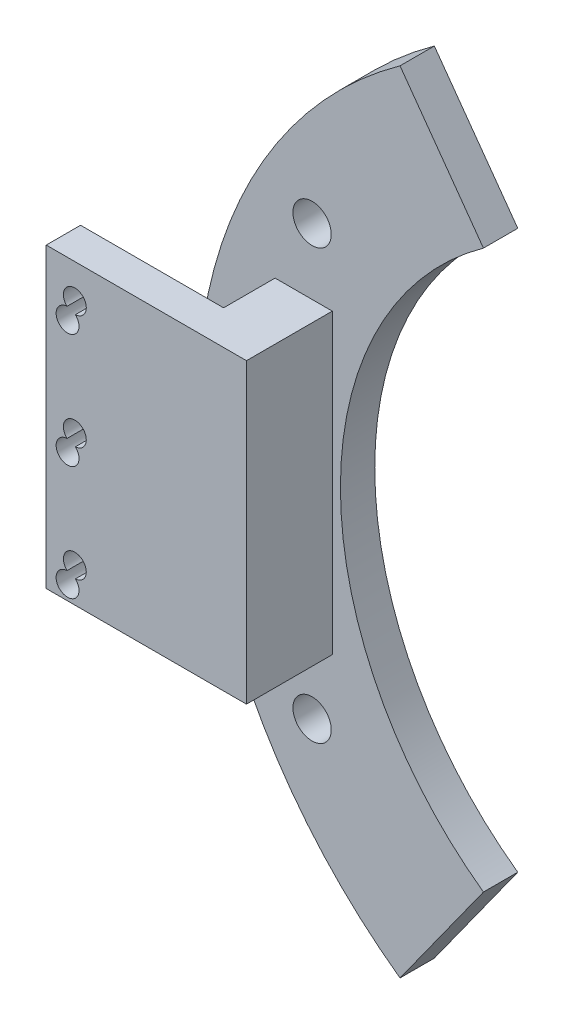
ISO-10303-21;
HEADER;
FILE_DESCRIPTION(('STEP AP214'),'2;1');
FILE_NAME('part.step','',(''),(''),'','','');
FILE_SCHEMA(('AUTOMOTIVE_DESIGN { 1 0 10303 214 1 1 1 1 }'));
ENDSEC;
DATA;
#1=APPLICATION_CONTEXT('core data for automotive mechanical design processes');
#2=APPLICATION_PROTOCOL_DEFINITION('international standard','automotive_design',2000,#1);
#3=PRODUCT_CONTEXT('',#1,'mechanical');
#4=PRODUCT('Part','Part','',(#3));
#5=PRODUCT_RELATED_PRODUCT_CATEGORY('part','',(#4));
#6=PRODUCT_DEFINITION_FORMATION('','',#4);
#7=PRODUCT_DEFINITION_CONTEXT('part definition',#1,'design');
#8=PRODUCT_DEFINITION('design','',#6,#7);
#9=PRODUCT_DEFINITION_SHAPE('','',#8);
#10=(LENGTH_UNIT() NAMED_UNIT(*) SI_UNIT(.MILLI.,.METRE.));
#11=(NAMED_UNIT(*) PLANE_ANGLE_UNIT() SI_UNIT($,.RADIAN.));
#12=(NAMED_UNIT(*) SI_UNIT($,.STERADIAN.) SOLID_ANGLE_UNIT());
#13=UNCERTAINTY_MEASURE_WITH_UNIT(LENGTH_MEASURE(1.E-05),#10,'distance_accuracy_value','');
#14=(GEOMETRIC_REPRESENTATION_CONTEXT(3) GLOBAL_UNCERTAINTY_ASSIGNED_CONTEXT((#13)) GLOBAL_UNIT_ASSIGNED_CONTEXT((#10,
#11,#12)) REPRESENTATION_CONTEXT('',''));
#15=CARTESIAN_POINT('',(0.,0.,0.));
#16=DIRECTION('',(0.,0.,1.));
#17=DIRECTION('',(1.,0.,0.));
#18=AXIS2_PLACEMENT_3D('',#15,#16,#17);
#19=CARTESIAN_POINT('',(-71.4195328291549,25.9902704667621,21.));
#20=DIRECTION('',(1.,0.,0.));
#21=DIRECTION('',(0.,0.,-1.));
#22=AXIS2_PLACEMENT_3D('',#19,#20,#21);
#23=PLANE('',#22);
#24=DIRECTION('',(0.,-1.,0.));
#25=VECTOR('',#24,1.);
#26=CARTESIAN_POINT('',(-71.4195328291549,25.9902704667621,15.));
#27=LINE('',#26,#25);
#28=CARTESIAN_POINT('',(-71.4195328291549,25.9902704667621,15.));
#29=VERTEX_POINT('',#28);
#30=CARTESIAN_POINT('',(-71.4195328291549,-26.0097295332379,15.));
#31=VERTEX_POINT('',#30);
#32=EDGE_CURVE('E189',#29,#31,#27,.T.);
#33=ORIENTED_EDGE('',*,*,#32,.F.);
#34=DIRECTION('',(0.,0.,-1.));
#35=VECTOR('',#34,1.);
#36=CARTESIAN_POINT('',(-71.4195328291549,25.9902704667621,21.));
#37=LINE('',#36,#35);
#38=CARTESIAN_POINT('',(-71.4195328291549,25.9902704667621,6.));
#39=VERTEX_POINT('',#38);
#40=EDGE_CURVE('E211',#29,#39,#37,.T.);
#41=ORIENTED_EDGE('',*,*,#40,.T.);
#42=DIRECTION('',(0.,-1.,0.));
#43=VECTOR('',#42,1.);
#44=CARTESIAN_POINT('',(-71.4195328291549,25.9902704667621,6.));
#45=LINE('',#44,#43);
#46=CARTESIAN_POINT('',(-71.4195328291549,-26.0097295332379,6.));
#47=VERTEX_POINT('',#46);
#48=EDGE_CURVE('E203',#39,#47,#45,.T.);
#49=ORIENTED_EDGE('',*,*,#48,.T.);
#50=DIRECTION('',(0.,0.,-1.));
#51=VECTOR('',#50,1.);
#52=CARTESIAN_POINT('',(-71.4195328291549,-26.0097295332379,21.));
#53=LINE('',#52,#51);
#54=EDGE_CURVE('E227',#31,#47,#53,.T.);
#55=ORIENTED_EDGE('',*,*,#54,.F.);
#56=EDGE_LOOP('',(#33,#41,#49,#55));
#57=FACE_BOUND('',#56,.T.);
#58=ADVANCED_FACE('F41',(#57),#23,.F.);
#59=CARTESIAN_POINT('',(0.,0.,6.));
#60=DIRECTION('',(0.,0.,1.));
#61=DIRECTION('',(1.,0.,0.));
#62=AXIS2_PLACEMENT_3D('',#59,#60,#61);
#63=PLANE('',#62);
#64=DIRECTION('',(-0.583333333333333,-0.812232862067414,0.));
#65=VECTOR('',#64,1.);
#66=CARTESIAN_POINT('',(0.,0.,6.));
#67=LINE('',#66,#65);
#68=CARTESIAN_POINT('',(-35.,-48.7339717240448,6.));
#69=VERTEX_POINT('',#68);
#70=CARTESIAN_POINT('',(-49.5833333333334,-69.0397932757301,6.));
#71=VERTEX_POINT('',#70);
#72=EDGE_CURVE('E181',#69,#71,#67,.T.);
#73=ORIENTED_EDGE('',*,*,#72,.F.);
#74=CARTESIAN_POINT('',(0.,0.,6.));
#75=DIRECTION('',(0.,0.,1.));
#76=DIRECTION('',(1.,0.,0.));
#77=AXIS2_PLACEMENT_3D('',#74,#75,#76);
#78=CIRCLE('',#77,60.);
#79=CARTESIAN_POINT('',(-35.,48.7339717240448,6.));
#80=VERTEX_POINT('',#79);
#81=EDGE_CURVE('E236',#80,#69,#78,.T.);
#82=ORIENTED_EDGE('',*,*,#81,.F.);
#83=DIRECTION('',(0.583333333333334,-0.812232862067413,0.));
#84=VECTOR('',#83,1.);
#85=CARTESIAN_POINT('',(0.,0.,6.));
#86=LINE('',#85,#84);
#87=CARTESIAN_POINT('',(-49.5833333333334,69.0397932757302,6.));
#88=VERTEX_POINT('',#87);
#89=EDGE_CURVE('E290',#88,#80,#86,.T.);
#90=ORIENTED_EDGE('',*,*,#89,.F.);
#91=CARTESIAN_POINT('',(0.,0.,6.));
#92=DIRECTION('',(0.,0.,1.));
#93=DIRECTION('',(1.,0.,0.));
#94=AXIS2_PLACEMENT_3D('',#91,#92,#93);
#95=CIRCLE('',#94,85.);
#96=EDGE_CURVE('E244',#88,#71,#95,.T.);
#97=ORIENTED_EDGE('',*,*,#96,.T.);
#98=EDGE_LOOP('',(#73,#82,#90,#97));
#99=FACE_BOUND('',#98,.T.);
#100=CARTESIAN_POINT('',(-64.951905283833,37.4999999999998,6.));
#101=DIRECTION('',(0.,0.,1.));
#102=DIRECTION('',(-1.,0.,0.));
#103=AXIS2_PLACEMENT_3D('',#100,#101,#102);
#104=CIRCLE('',#103,3.35);
#105=CARTESIAN_POINT('',(-68.301905283833,37.4999999999998,6.));
#106=VERTEX_POINT('',#105);
#107=EDGE_CURVE('E229',#106,#106,#104,.T.);
#108=ORIENTED_EDGE('',*,*,#107,.F.);
#109=EDGE_LOOP('',(#108));
#110=FACE_BOUND('',#109,.T.);
#111=CARTESIAN_POINT('',(-64.9519052838327,-37.5000000000003,6.));
#112=DIRECTION('',(0.,0.,1.));
#113=DIRECTION('',(-1.,0.,0.));
#114=AXIS2_PLACEMENT_3D('',#111,#112,#113);
#115=CIRCLE('',#114,3.35);
#116=CARTESIAN_POINT('',(-68.3019052838327,-37.5000000000003,6.));
#117=VERTEX_POINT('',#116);
#118=EDGE_CURVE('E232',#117,#117,#115,.T.);
#119=ORIENTED_EDGE('',*,*,#118,.F.);
#120=EDGE_LOOP('',(#119));
#121=FACE_BOUND('',#120,.T.);
#122=DIRECTION('',(1.,0.,0.));
#123=VECTOR('',#122,1.);
#124=CARTESIAN_POINT('',(-71.4195328291549,-26.0097295332379,6.));
#125=LINE('',#124,#123);
#126=CARTESIAN_POINT('',(-61.4195328291549,-26.0097295332379,6.));
#127=VERTEX_POINT('',#126);
#128=EDGE_CURVE('E214',#47,#127,#125,.T.);
#129=ORIENTED_EDGE('',*,*,#128,.F.);
#130=ORIENTED_EDGE('',*,*,#48,.F.);
#131=DIRECTION('',(-1.,0.,0.));
#132=VECTOR('',#131,1.);
#133=CARTESIAN_POINT('',(-71.4195328291549,25.9902704667621,6.));
#134=LINE('',#133,#132);
#135=CARTESIAN_POINT('',(-61.4195328291549,25.9902704667621,6.));
#136=VERTEX_POINT('',#135);
#137=EDGE_CURVE('E207',#136,#39,#134,.T.);
#138=ORIENTED_EDGE('',*,*,#137,.F.);
#139=DIRECTION('',(0.,1.,0.));
#140=VECTOR('',#139,1.);
#141=CARTESIAN_POINT('',(-61.4195328291549,25.9902704667621,6.));
#142=LINE('',#141,#140);
#143=EDGE_CURVE('E216',#127,#136,#142,.T.);
#144=ORIENTED_EDGE('',*,*,#143,.F.);
#145=EDGE_LOOP('',(#129,#130,#138,#144));
#146=FACE_BOUND('',#145,.T.);
#147=ADVANCED_FACE('F305',(#99,#110,#121,#146),#63,.T.);
#148=CARTESIAN_POINT('',(0.,0.,0.));
#149=DIRECTION('',(0.,0.,1.));
#150=DIRECTION('',(1.,0.,0.));
#151=AXIS2_PLACEMENT_3D('',#148,#149,#150);
#152=PLANE('',#151);
#153=CARTESIAN_POINT('',(-64.951905283833,37.4999999999998,0.));
#154=DIRECTION('',(0.,0.,1.));
#155=DIRECTION('',(1.,0.,0.));
#156=AXIS2_PLACEMENT_3D('',#153,#154,#155);
#157=CIRCLE('',#156,3.35);
#158=CARTESIAN_POINT('',(-61.601905283833,37.4999999999998,0.));
#159=VERTEX_POINT('',#158);
#160=EDGE_CURVE('E243',#159,#159,#157,.T.);
#161=ORIENTED_EDGE('',*,*,#160,.T.);
#162=EDGE_LOOP('',(#161));
#163=FACE_BOUND('',#162,.T.);
#164=CARTESIAN_POINT('',(-64.9519052838327,-37.5000000000003,0.));
#165=DIRECTION('',(0.,0.,1.));
#166=DIRECTION('',(1.,0.,0.));
#167=AXIS2_PLACEMENT_3D('',#164,#165,#166);
#168=CIRCLE('',#167,3.35);
#169=CARTESIAN_POINT('',(-61.6019052838327,-37.5000000000003,0.));
#170=VERTEX_POINT('',#169);
#171=EDGE_CURVE('E235',#170,#170,#168,.T.);
#172=ORIENTED_EDGE('',*,*,#171,.T.);
#173=EDGE_LOOP('',(#172));
#174=FACE_BOUND('',#173,.T.);
#175=CARTESIAN_POINT('',(0.,0.,0.));
#176=DIRECTION('',(0.,0.,1.));
#177=DIRECTION('',(1.,0.,0.));
#178=AXIS2_PLACEMENT_3D('',#175,#176,#177);
#179=CIRCLE('',#178,60.);
#180=CARTESIAN_POINT('',(-35.,48.7339717240448,0.));
#181=VERTEX_POINT('',#180);
#182=CARTESIAN_POINT('',(-35.,-48.7339717240448,0.));
#183=VERTEX_POINT('',#182);
#184=EDGE_CURVE('E240',#181,#183,#179,.T.);
#185=ORIENTED_EDGE('',*,*,#184,.T.);
#186=DIRECTION('',(-0.583333333333333,-0.812232862067414,0.));
#187=VECTOR('',#186,1.);
#188=CARTESIAN_POINT('',(0.,0.,0.));
#189=LINE('',#188,#187);
#190=CARTESIAN_POINT('',(-49.5833333333334,-69.0397932757301,0.));
#191=VERTEX_POINT('',#190);
#192=EDGE_CURVE('E292',#183,#191,#189,.T.);
#193=ORIENTED_EDGE('',*,*,#192,.T.);
#194=CARTESIAN_POINT('',(0.,0.,0.));
#195=DIRECTION('',(0.,0.,1.));
#196=DIRECTION('',(1.,0.,0.));
#197=AXIS2_PLACEMENT_3D('',#194,#195,#196);
#198=CIRCLE('',#197,85.);
#199=CARTESIAN_POINT('',(-49.5833333333334,69.0397932757302,0.));
#200=VERTEX_POINT('',#199);
#201=EDGE_CURVE('E239',#200,#191,#198,.T.);
#202=ORIENTED_EDGE('',*,*,#201,.F.);
#203=DIRECTION('',(0.583333333333334,-0.812232862067413,0.));
#204=VECTOR('',#203,1.);
#205=CARTESIAN_POINT('',(0.,0.,0.));
#206=LINE('',#205,#204);
#207=EDGE_CURVE('E286',#200,#181,#206,.T.);
#208=ORIENTED_EDGE('',*,*,#207,.T.);
#209=EDGE_LOOP('',(#185,#193,#202,#208));
#210=FACE_BOUND('',#209,.T.);
#211=ADVANCED_FACE('F314',(#163,#174,#210),#152,.F.);
#212=CARTESIAN_POINT('',(0.,0.,6.));
#213=DIRECTION('',(0.,0.,-1.));
#214=DIRECTION('',(-1.,0.,0.));
#215=AXIS2_PLACEMENT_3D('',#212,#213,#214);
#216=CYLINDRICAL_SURFACE('',#215,85.);
#217=ORIENTED_EDGE('',*,*,#201,.T.);
#218=DIRECTION('',(0.,0.,1.));
#219=VECTOR('',#218,1.);
#220=CARTESIAN_POINT('',(-49.5833333333334,-69.0397932757301,-44.));
#221=LINE('',#220,#219);
#222=EDGE_CURVE('E283',#191,#71,#221,.T.);
#223=ORIENTED_EDGE('',*,*,#222,.T.);
#224=ORIENTED_EDGE('',*,*,#96,.F.);
#225=DIRECTION('',(0.,0.,1.));
#226=VECTOR('',#225,1.);
#227=CARTESIAN_POINT('',(-49.5833333333334,69.0397932757302,-44.));
#228=LINE('',#227,#226);
#229=EDGE_CURVE('E278',#200,#88,#228,.T.);
#230=ORIENTED_EDGE('',*,*,#229,.F.);
#231=EDGE_LOOP('',(#217,#223,#224,#230));
#232=FACE_BOUND('',#231,.T.);
#233=ADVANCED_FACE('F43',(#232),#216,.T.);
#234=CARTESIAN_POINT('',(0.,0.,6.));
#235=DIRECTION('',(0.,0.,-1.));
#236=DIRECTION('',(-1.,0.,0.));
#237=AXIS2_PLACEMENT_3D('',#234,#235,#236);
#238=CYLINDRICAL_SURFACE('',#237,60.);
#239=DIRECTION('',(0.,0.,-1.));
#240=VECTOR('',#239,1.);
#241=CARTESIAN_POINT('',(-35.,-48.7339717240448,6.));
#242=LINE('',#241,#240);
#243=EDGE_CURVE('E165',#183,#69,#242,.F.);
#244=ORIENTED_EDGE('',*,*,#243,.F.);
#245=ORIENTED_EDGE('',*,*,#184,.F.);
#246=DIRECTION('',(0.,0.,-1.));
#247=VECTOR('',#246,1.);
#248=CARTESIAN_POINT('',(-35.,48.7339717240448,6.));
#249=LINE('',#248,#247);
#250=EDGE_CURVE('E247',#80,#181,#249,.T.);
#251=ORIENTED_EDGE('',*,*,#250,.F.);
#252=ORIENTED_EDGE('',*,*,#81,.T.);
#253=EDGE_LOOP('',(#244,#245,#251,#252));
#254=FACE_BOUND('',#253,.T.);
#255=ADVANCED_FACE('F312',(#254),#238,.F.);
#256=CARTESIAN_POINT('',(-64.9519052838327,-37.5000000000003,-4.));
#257=DIRECTION('',(0.,0.,1.));
#258=DIRECTION('',(1.,0.,0.));
#259=AXIS2_PLACEMENT_3D('',#256,#257,#258);
#260=CYLINDRICAL_SURFACE('',#259,3.35);
#261=ORIENTED_EDGE('',*,*,#118,.T.);
#262=EDGE_LOOP('',(#261));
#263=FACE_BOUND('',#262,.T.);
#264=ORIENTED_EDGE('',*,*,#171,.F.);
#265=EDGE_LOOP('',(#264));
#266=FACE_BOUND('',#265,.T.);
#267=ADVANCED_FACE('F338',(#263,#266),#260,.F.);
#268=CARTESIAN_POINT('',(-64.951905283833,37.4999999999998,-4.));
#269=DIRECTION('',(0.,0.,1.));
#270=DIRECTION('',(1.,0.,0.));
#271=AXIS2_PLACEMENT_3D('',#268,#269,#270);
#272=CYLINDRICAL_SURFACE('',#271,3.35);
#273=ORIENTED_EDGE('',*,*,#107,.T.);
#274=EDGE_LOOP('',(#273));
#275=FACE_BOUND('',#274,.T.);
#276=ORIENTED_EDGE('',*,*,#160,.F.);
#277=EDGE_LOOP('',(#276));
#278=FACE_BOUND('',#277,.T.);
#279=ADVANCED_FACE('F335',(#275,#278),#272,.F.);
#280=CARTESIAN_POINT('',(-71.4195328291549,-26.0097295332379,21.));
#281=DIRECTION('',(0.,1.,0.));
#282=DIRECTION('',(0.,0.,1.));
#283=AXIS2_PLACEMENT_3D('',#280,#281,#282);
#284=PLANE('',#283);
#285=ORIENTED_EDGE('',*,*,#128,.T.);
#286=DIRECTION('',(0.,0.,-1.));
#287=VECTOR('',#286,1.);
#288=CARTESIAN_POINT('',(-61.4195328291549,-26.0097295332379,21.));
#289=LINE('',#288,#287);
#290=CARTESIAN_POINT('',(-61.4195328291549,-26.0097295332379,21.));
#291=VERTEX_POINT('',#290);
#292=EDGE_CURVE('E224',#291,#127,#289,.T.);
#293=ORIENTED_EDGE('',*,*,#292,.F.);
#294=DIRECTION('',(1.,0.,0.));
#295=VECTOR('',#294,1.);
#296=CARTESIAN_POINT('',(-71.4195328291549,-26.0097295332379,21.));
#297=LINE('',#296,#295);
#298=CARTESIAN_POINT('',(-96.4195328291549,-26.0097295332379,21.));
#299=VERTEX_POINT('',#298);
#300=EDGE_CURVE('E204',#299,#291,#297,.T.);
#301=ORIENTED_EDGE('',*,*,#300,.F.);
#302=DIRECTION('',(0.,0.,1.));
#303=VECTOR('',#302,1.);
#304=CARTESIAN_POINT('',(-96.4195328291549,-26.0097295332379,21.));
#305=LINE('',#304,#303);
#306=CARTESIAN_POINT('',(-96.4195328291549,-26.0097295332379,15.));
#307=VERTEX_POINT('',#306);
#308=EDGE_CURVE('E193',#307,#299,#305,.T.);
#309=ORIENTED_EDGE('',*,*,#308,.F.);
#310=DIRECTION('',(1.,0.,0.));
#311=VECTOR('',#310,1.);
#312=CARTESIAN_POINT('',(-96.4195328291549,-26.0097295332379,15.));
#313=LINE('',#312,#311);
#314=EDGE_CURVE('E196',#307,#31,#313,.T.);
#315=ORIENTED_EDGE('',*,*,#314,.T.);
#316=ORIENTED_EDGE('',*,*,#54,.T.);
#317=EDGE_LOOP('',(#285,#293,#301,#309,#315,#316));
#318=FACE_BOUND('',#317,.T.);
#319=ADVANCED_FACE('F333',(#318),#284,.F.);
#320=CARTESIAN_POINT('',(-61.4195328291549,25.9902704667621,21.));
#321=DIRECTION('',(-1.,0.,0.));
#322=DIRECTION('',(0.,-1.,0.));
#323=AXIS2_PLACEMENT_3D('',#320,#321,#322);
#324=PLANE('',#323);
#325=ORIENTED_EDGE('',*,*,#143,.T.);
#326=DIRECTION('',(0.,0.,-1.));
#327=VECTOR('',#326,1.);
#328=CARTESIAN_POINT('',(-61.4195328291549,25.9902704667621,21.));
#329=LINE('',#328,#327);
#330=CARTESIAN_POINT('',(-61.4195328291549,25.9902704667621,21.));
#331=VERTEX_POINT('',#330);
#332=EDGE_CURVE('E222',#331,#136,#329,.T.);
#333=ORIENTED_EDGE('',*,*,#332,.F.);
#334=DIRECTION('',(0.,1.,0.));
#335=VECTOR('',#334,1.);
#336=CARTESIAN_POINT('',(-61.4195328291549,25.9902704667621,21.));
#337=LINE('',#336,#335);
#338=EDGE_CURVE('E206',#291,#331,#337,.T.);
#339=ORIENTED_EDGE('',*,*,#338,.F.);
#340=ORIENTED_EDGE('',*,*,#292,.T.);
#341=EDGE_LOOP('',(#325,#333,#339,#340));
#342=FACE_BOUND('',#341,.T.);
#343=ADVANCED_FACE('F462',(#342),#324,.F.);
#344=CARTESIAN_POINT('',(-71.4195328291549,25.9902704667621,21.));
#345=DIRECTION('',(0.,-1.,0.));
#346=DIRECTION('',(0.,0.,-1.));
#347=AXIS2_PLACEMENT_3D('',#344,#345,#346);
#348=PLANE('',#347);
#349=ORIENTED_EDGE('',*,*,#137,.T.);
#350=ORIENTED_EDGE('',*,*,#40,.F.);
#351=DIRECTION('',(1.,0.,0.));
#352=VECTOR('',#351,1.);
#353=CARTESIAN_POINT('',(-96.4195328291549,25.9902704667621,15.));
#354=LINE('',#353,#352);
#355=CARTESIAN_POINT('',(-96.4195328291549,25.9902704667621,15.));
#356=VERTEX_POINT('',#355);
#357=EDGE_CURVE('E201',#356,#29,#354,.T.);
#358=ORIENTED_EDGE('',*,*,#357,.F.);
#359=DIRECTION('',(0.,0.,-1.));
#360=VECTOR('',#359,1.);
#361=CARTESIAN_POINT('',(-96.4195328291549,25.9902704667621,21.));
#362=LINE('',#361,#360);
#363=CARTESIAN_POINT('',(-96.4195328291549,25.9902704667621,21.));
#364=VERTEX_POINT('',#363);
#365=EDGE_CURVE('E188',#364,#356,#362,.T.);
#366=ORIENTED_EDGE('',*,*,#365,.F.);
#367=DIRECTION('',(-1.,0.,0.));
#368=VECTOR('',#367,1.);
#369=CARTESIAN_POINT('',(-71.4195328291549,25.9902704667621,21.));
#370=LINE('',#369,#368);
#371=EDGE_CURVE('E209',#331,#364,#370,.T.);
#372=ORIENTED_EDGE('',*,*,#371,.F.);
#373=ORIENTED_EDGE('',*,*,#332,.T.);
#374=EDGE_LOOP('',(#349,#350,#358,#366,#372,#373));
#375=FACE_BOUND('',#374,.T.);
#376=ADVANCED_FACE('F372',(#375),#348,.F.);
#377=CARTESIAN_POINT('',(0.,0.,21.));
#378=DIRECTION('',(0.,0.,1.));
#379=DIRECTION('',(1.,0.,0.));
#380=AXIS2_PLACEMENT_3D('',#377,#378,#379);
#381=PLANE('',#380);
#382=CARTESIAN_POINT('',(-92.6897351773641,-23.4597731012383,21.));
#383=DIRECTION('',(0.,0.,1.));
#384=DIRECTION('',(1.,0.,0.));
#385=AXIS2_PLACEMENT_3D('',#382,#383,#384);
#386=CIRCLE('',#385,2.);
#387=CARTESIAN_POINT('',(-92.7842781694253,-21.462008945325,21.));
#388=VERTEX_POINT('',#387);
#389=CARTESIAN_POINT('',(-91.3249898370937,-21.9977641559133,21.));
#390=VERTEX_POINT('',#389);
#391=EDGE_CURVE('E276',#388,#390,#386,.T.);
#392=ORIENTED_EDGE('',*,*,#391,.F.);
#393=CARTESIAN_POINT('',(-91.4195328291549,-20.,21.));
#394=DIRECTION('',(0.,0.,1.));
#395=DIRECTION('',(-1.,0.,0.));
#396=AXIS2_PLACEMENT_3D('',#393,#394,#395);
#397=CIRCLE('',#396,2.);
#398=EDGE_CURVE('E175',#390,#388,#397,.T.);
#399=ORIENTED_EDGE('',*,*,#398,.F.);
#400=EDGE_LOOP('',(#392,#399));
#401=FACE_BOUND('',#400,.T.);
#402=CARTESIAN_POINT('',(-92.6897351773641,-3.45977310123833,21.));
#403=DIRECTION('',(0.,0.,1.));
#404=DIRECTION('',(1.,0.,0.));
#405=AXIS2_PLACEMENT_3D('',#402,#403,#404);
#406=CIRCLE('',#405,2.);
#407=CARTESIAN_POINT('',(-92.7842781694253,-1.462008945325,21.));
#408=VERTEX_POINT('',#407);
#409=CARTESIAN_POINT('',(-91.3249898370938,-1.99776415591333,21.));
#410=VERTEX_POINT('',#409);
#411=EDGE_CURVE('E275',#408,#410,#406,.T.);
#412=ORIENTED_EDGE('',*,*,#411,.F.);
#413=CARTESIAN_POINT('',(-91.4195328291549,0.,21.));
#414=DIRECTION('',(0.,0.,1.));
#415=DIRECTION('',(1.,0.,0.));
#416=AXIS2_PLACEMENT_3D('',#413,#414,#415);
#417=CIRCLE('',#416,2.);
#418=EDGE_CURVE('E174',#410,#408,#417,.T.);
#419=ORIENTED_EDGE('',*,*,#418,.F.);
#420=EDGE_LOOP('',(#412,#419));
#421=FACE_BOUND('',#420,.T.);
#422=CARTESIAN_POINT('',(-92.6897351773641,16.5402268987617,21.));
#423=DIRECTION('',(0.,0.,1.));
#424=DIRECTION('',(1.,0.,0.));
#425=AXIS2_PLACEMENT_3D('',#422,#423,#424);
#426=CIRCLE('',#425,2.);
#427=CARTESIAN_POINT('',(-92.7842781694253,18.537991054675,21.));
#428=VERTEX_POINT('',#427);
#429=CARTESIAN_POINT('',(-91.3249898370938,18.0022358440867,21.));
#430=VERTEX_POINT('',#429);
#431=EDGE_CURVE('E156',#428,#430,#426,.T.);
#432=ORIENTED_EDGE('',*,*,#431,.F.);
#433=CARTESIAN_POINT('',(-91.4195328291549,20.,21.));
#434=DIRECTION('',(0.,0.,1.));
#435=DIRECTION('',(1.,0.,0.));
#436=AXIS2_PLACEMENT_3D('',#433,#434,#435);
#437=CIRCLE('',#436,2.);
#438=EDGE_CURVE('E171',#430,#428,#437,.T.);
#439=ORIENTED_EDGE('',*,*,#438,.F.);
#440=EDGE_LOOP('',(#432,#439));
#441=FACE_BOUND('',#440,.T.);
#442=ORIENTED_EDGE('',*,*,#371,.T.);
#443=DIRECTION('',(0.,1.,0.));
#444=VECTOR('',#443,1.);
#445=CARTESIAN_POINT('',(-96.4195328291549,25.9902704667621,21.));
#446=LINE('',#445,#444);
#447=EDGE_CURVE('E185',#299,#364,#446,.T.);
#448=ORIENTED_EDGE('',*,*,#447,.F.);
#449=ORIENTED_EDGE('',*,*,#300,.T.);
#450=ORIENTED_EDGE('',*,*,#338,.T.);
#451=EDGE_LOOP('',(#442,#448,#449,#450));
#452=FACE_BOUND('',#451,.T.);
#453=ADVANCED_FACE('F169',(#401,#421,#441,#452),#381,.T.);
#454=CARTESIAN_POINT('',(-96.4195328291549,25.9902704667621,15.));
#455=DIRECTION('',(0.,0.,1.));
#456=DIRECTION('',(0.,-1.,0.));
#457=AXIS2_PLACEMENT_3D('',#454,#455,#456);
#458=PLANE('',#457);
#459=CARTESIAN_POINT('',(-91.4195328291549,20.,15.));
#460=DIRECTION('',(0.,0.,1.));
#461=DIRECTION('',(0.,-1.,0.));
#462=AXIS2_PLACEMENT_3D('',#459,#460,#461);
#463=CIRCLE('',#462,2.);
#464=CARTESIAN_POINT('',(-91.3249898370938,18.0022358440867,15.));
#465=VERTEX_POINT('',#464);
#466=CARTESIAN_POINT('',(-92.7842781694253,18.537991054675,15.));
#467=VERTEX_POINT('',#466);
#468=EDGE_CURVE('E198',#465,#467,#463,.T.);
#469=ORIENTED_EDGE('',*,*,#468,.T.);
#470=CARTESIAN_POINT('',(-92.6897351773641,16.5402268987617,15.));
#471=DIRECTION('',(0.,0.,1.));
#472=DIRECTION('',(0.,-1.,0.));
#473=AXIS2_PLACEMENT_3D('',#470,#471,#472);
#474=CIRCLE('',#473,2.);
#475=EDGE_CURVE('E159',#467,#465,#474,.T.);
#476=ORIENTED_EDGE('',*,*,#475,.T.);
#477=EDGE_LOOP('',(#469,#476));
#478=FACE_BOUND('',#477,.T.);
#479=CARTESIAN_POINT('',(-91.4195328291549,-20.,15.));
#480=DIRECTION('',(0.,0.,1.));
#481=DIRECTION('',(0.,-1.,0.));
#482=AXIS2_PLACEMENT_3D('',#479,#480,#481);
#483=CIRCLE('',#482,2.);
#484=CARTESIAN_POINT('',(-91.3249898370937,-21.9977641559133,15.));
#485=VERTEX_POINT('',#484);
#486=CARTESIAN_POINT('',(-92.7842781694253,-21.462008945325,15.));
#487=VERTEX_POINT('',#486);
#488=EDGE_CURVE('E256',#485,#487,#483,.T.);
#489=ORIENTED_EDGE('',*,*,#488,.T.);
#490=CARTESIAN_POINT('',(-92.6897351773641,-23.4597731012383,15.));
#491=DIRECTION('',(0.,0.,1.));
#492=DIRECTION('',(0.,-1.,0.));
#493=AXIS2_PLACEMENT_3D('',#490,#491,#492);
#494=CIRCLE('',#493,2.);
#495=EDGE_CURVE('E64',#487,#485,#494,.T.);
#496=ORIENTED_EDGE('',*,*,#495,.T.);
#497=EDGE_LOOP('',(#489,#496));
#498=FACE_BOUND('',#497,.T.);
#499=CARTESIAN_POINT('',(-91.4195328291549,0.,15.));
#500=DIRECTION('',(0.,0.,1.));
#501=DIRECTION('',(0.,-1.,0.));
#502=AXIS2_PLACEMENT_3D('',#499,#500,#501);
#503=CIRCLE('',#502,2.);
#504=CARTESIAN_POINT('',(-91.3249898370938,-1.99776415591333,15.));
#505=VERTEX_POINT('',#504);
#506=CARTESIAN_POINT('',(-92.7842781694253,-1.46200894532499,15.));
#507=VERTEX_POINT('',#506);
#508=EDGE_CURVE('E178',#505,#507,#503,.T.);
#509=ORIENTED_EDGE('',*,*,#508,.T.);
#510=CARTESIAN_POINT('',(-92.6897351773641,-3.45977310123833,15.));
#511=DIRECTION('',(0.,0.,1.));
#512=DIRECTION('',(0.,-1.,0.));
#513=AXIS2_PLACEMENT_3D('',#510,#511,#512);
#514=CIRCLE('',#513,2.);
#515=EDGE_CURVE('E56',#507,#505,#514,.T.);
#516=ORIENTED_EDGE('',*,*,#515,.T.);
#517=EDGE_LOOP('',(#509,#516));
#518=FACE_BOUND('',#517,.T.);
#519=ORIENTED_EDGE('',*,*,#32,.T.);
#520=ORIENTED_EDGE('',*,*,#314,.F.);
#521=DIRECTION('',(0.,-1.,0.));
#522=VECTOR('',#521,1.);
#523=CARTESIAN_POINT('',(-96.4195328291549,25.9902704667621,15.));
#524=LINE('',#523,#522);
#525=EDGE_CURVE('E191',#356,#307,#524,.T.);
#526=ORIENTED_EDGE('',*,*,#525,.F.);
#527=ORIENTED_EDGE('',*,*,#357,.T.);
#528=EDGE_LOOP('',(#519,#520,#526,#527));
#529=FACE_BOUND('',#528,.T.);
#530=ADVANCED_FACE('F273',(#478,#498,#518,#529),#458,.F.);
#531=CARTESIAN_POINT('',(-96.4195328291549,0.,0.));
#532=DIRECTION('',(1.,0.,0.));
#533=DIRECTION('',(0.,0.,-1.));
#534=AXIS2_PLACEMENT_3D('',#531,#532,#533);
#535=PLANE('',#534);
#536=ORIENTED_EDGE('',*,*,#447,.T.);
#537=ORIENTED_EDGE('',*,*,#365,.T.);
#538=ORIENTED_EDGE('',*,*,#525,.T.);
#539=ORIENTED_EDGE('',*,*,#308,.T.);
#540=EDGE_LOOP('',(#536,#537,#538,#539));
#541=FACE_BOUND('',#540,.T.);
#542=ADVANCED_FACE('F382',(#541),#535,.F.);
#543=CARTESIAN_POINT('',(-91.4195328291549,0.,-4.));
#544=DIRECTION('',(0.,0.,1.));
#545=DIRECTION('',(1.,0.,0.));
#546=AXIS2_PLACEMENT_3D('',#543,#544,#545);
#547=CYLINDRICAL_SURFACE('',#546,2.);
#548=ORIENTED_EDGE('',*,*,#508,.F.);
#549=DIRECTION('',(0.,0.,1.));
#550=VECTOR('',#549,1.);
#551=CARTESIAN_POINT('',(-91.3249898370938,-1.99776415591333,16.));
#552=LINE('',#551,#550);
#553=EDGE_CURVE('E11',#505,#410,#552,.T.);
#554=ORIENTED_EDGE('',*,*,#553,.T.);
#555=ORIENTED_EDGE('',*,*,#418,.T.);
#556=DIRECTION('',(0.,0.,1.));
#557=VECTOR('',#556,1.);
#558=CARTESIAN_POINT('',(-92.7842781694253,-1.462008945325,16.));
#559=LINE('',#558,#557);
#560=EDGE_CURVE('E49',#408,#507,#559,.F.);
#561=ORIENTED_EDGE('',*,*,#560,.T.);
#562=EDGE_LOOP('',(#548,#554,#555,#561));
#563=FACE_BOUND('',#562,.T.);
#564=ADVANCED_FACE('F269',(#563),#547,.F.);
#565=CARTESIAN_POINT('',(-91.4195328291549,-20.,-4.));
#566=DIRECTION('',(0.,0.,1.));
#567=DIRECTION('',(1.,0.,0.));
#568=AXIS2_PLACEMENT_3D('',#565,#566,#567);
#569=CYLINDRICAL_SURFACE('',#568,2.);
#570=ORIENTED_EDGE('',*,*,#488,.F.);
#571=DIRECTION('',(0.,0.,1.));
#572=VECTOR('',#571,1.);
#573=CARTESIAN_POINT('',(-91.3249898370937,-21.9977641559133,16.));
#574=LINE('',#573,#572);
#575=EDGE_CURVE('E265',#485,#390,#574,.T.);
#576=ORIENTED_EDGE('',*,*,#575,.T.);
#577=ORIENTED_EDGE('',*,*,#398,.T.);
#578=DIRECTION('',(0.,0.,1.));
#579=VECTOR('',#578,1.);
#580=CARTESIAN_POINT('',(-92.7842781694253,-21.462008945325,16.));
#581=LINE('',#580,#579);
#582=EDGE_CURVE('E263',#388,#487,#581,.F.);
#583=ORIENTED_EDGE('',*,*,#582,.T.);
#584=EDGE_LOOP('',(#570,#576,#577,#583));
#585=FACE_BOUND('',#584,.T.);
#586=ADVANCED_FACE('F392',(#585),#569,.F.);
#587=CARTESIAN_POINT('',(-91.4195328291549,20.,-4.));
#588=DIRECTION('',(0.,0.,1.));
#589=DIRECTION('',(1.,0.,0.));
#590=AXIS2_PLACEMENT_3D('',#587,#588,#589);
#591=CYLINDRICAL_SURFACE('',#590,2.);
#592=ORIENTED_EDGE('',*,*,#468,.F.);
#593=DIRECTION('',(0.,0.,1.));
#594=VECTOR('',#593,1.);
#595=CARTESIAN_POINT('',(-91.3249898370938,18.0022358440867,16.));
#596=LINE('',#595,#594);
#597=EDGE_CURVE('E164',#465,#430,#596,.T.);
#598=ORIENTED_EDGE('',*,*,#597,.T.);
#599=ORIENTED_EDGE('',*,*,#438,.T.);
#600=DIRECTION('',(0.,0.,1.));
#601=VECTOR('',#600,1.);
#602=CARTESIAN_POINT('',(-92.7842781694253,18.537991054675,16.));
#603=LINE('',#602,#601);
#604=EDGE_CURVE('E153',#428,#467,#603,.F.);
#605=ORIENTED_EDGE('',*,*,#604,.T.);
#606=EDGE_LOOP('',(#592,#598,#599,#605));
#607=FACE_BOUND('',#606,.T.);
#608=ADVANCED_FACE('F173',(#607),#591,.F.);
#609=CARTESIAN_POINT('',(-35.,48.7339717240448,-44.));
#610=DIRECTION('',(-0.812232862067413,-0.583333333333334,0.));
#611=DIRECTION('',(0.583333333333334,-0.812232862067413,0.));
#612=AXIS2_PLACEMENT_3D('',#609,#610,#611);
#613=PLANE('',#612);
#614=ORIENTED_EDGE('',*,*,#89,.T.);
#615=ORIENTED_EDGE('',*,*,#250,.T.);
#616=ORIENTED_EDGE('',*,*,#207,.F.);
#617=ORIENTED_EDGE('',*,*,#229,.T.);
#618=EDGE_LOOP('',(#614,#615,#616,#617));
#619=FACE_BOUND('',#618,.T.);
#620=ADVANCED_FACE('F309',(#619),#613,.F.);
#621=CARTESIAN_POINT('',(-35.,-48.7339717240448,-44.));
#622=DIRECTION('',(-0.812232862067414,0.583333333333333,0.));
#623=DIRECTION('',(-0.583333333333333,-0.812232862067414,0.));
#624=AXIS2_PLACEMENT_3D('',#621,#622,#623);
#625=PLANE('',#624);
#626=ORIENTED_EDGE('',*,*,#72,.T.);
#627=ORIENTED_EDGE('',*,*,#222,.F.);
#628=ORIENTED_EDGE('',*,*,#192,.F.);
#629=ORIENTED_EDGE('',*,*,#243,.T.);
#630=EDGE_LOOP('',(#626,#627,#628,#629));
#631=FACE_BOUND('',#630,.T.);
#632=ADVANCED_FACE('F296',(#631),#625,.F.);
#633=CARTESIAN_POINT('',(-92.6897351773641,16.5402268987617,6.));
#634=DIRECTION('',(0.,0.,1.));
#635=DIRECTION('',(1.,0.,0.));
#636=AXIS2_PLACEMENT_3D('',#633,#634,#635);
#637=CYLINDRICAL_SURFACE('',#636,2.);
#638=ORIENTED_EDGE('',*,*,#475,.F.);
#639=ORIENTED_EDGE('',*,*,#604,.F.);
#640=ORIENTED_EDGE('',*,*,#431,.T.);
#641=ORIENTED_EDGE('',*,*,#597,.F.);
#642=EDGE_LOOP('',(#638,#639,#640,#641));
#643=FACE_BOUND('',#642,.T.);
#644=ADVANCED_FACE('F155',(#643),#637,.F.);
#645=CARTESIAN_POINT('',(-92.6897351773641,-23.4597731012383,6.));
#646=DIRECTION('',(0.,0.,1.));
#647=DIRECTION('',(1.,0.,0.));
#648=AXIS2_PLACEMENT_3D('',#645,#646,#647);
#649=CYLINDRICAL_SURFACE('',#648,2.);
#650=ORIENTED_EDGE('',*,*,#495,.F.);
#651=ORIENTED_EDGE('',*,*,#582,.F.);
#652=ORIENTED_EDGE('',*,*,#391,.T.);
#653=ORIENTED_EDGE('',*,*,#575,.F.);
#654=EDGE_LOOP('',(#650,#651,#652,#653));
#655=FACE_BOUND('',#654,.T.);
#656=ADVANCED_FACE('F413',(#655),#649,.F.);
#657=CARTESIAN_POINT('',(-92.6897351773641,-3.45977310123833,6.));
#658=DIRECTION('',(0.,0.,1.));
#659=DIRECTION('',(1.,0.,0.));
#660=AXIS2_PLACEMENT_3D('',#657,#658,#659);
#661=CYLINDRICAL_SURFACE('',#660,2.);
#662=ORIENTED_EDGE('',*,*,#515,.F.);
#663=ORIENTED_EDGE('',*,*,#560,.F.);
#664=ORIENTED_EDGE('',*,*,#411,.T.);
#665=ORIENTED_EDGE('',*,*,#553,.F.);
#666=EDGE_LOOP('',(#662,#663,#664,#665));
#667=FACE_BOUND('',#666,.T.);
#668=ADVANCED_FACE('F421',(#667),#661,.F.);
#669=CLOSED_SHELL('',(#58,#147,#211,#233,#255,#267,#279,#319,#343,#376,#453,#530,#542,#564,#586,
#608,#620,#632,#644,#656,#668));
#670=MANIFOLD_SOLID_BREP('B2',#669);
#671=ADVANCED_BREP_SHAPE_REPRESENTATION('',(#18,#670),#14);
#672=SHAPE_DEFINITION_REPRESENTATION(#9,#671);
ENDSEC;
END-ISO-10303-21;
